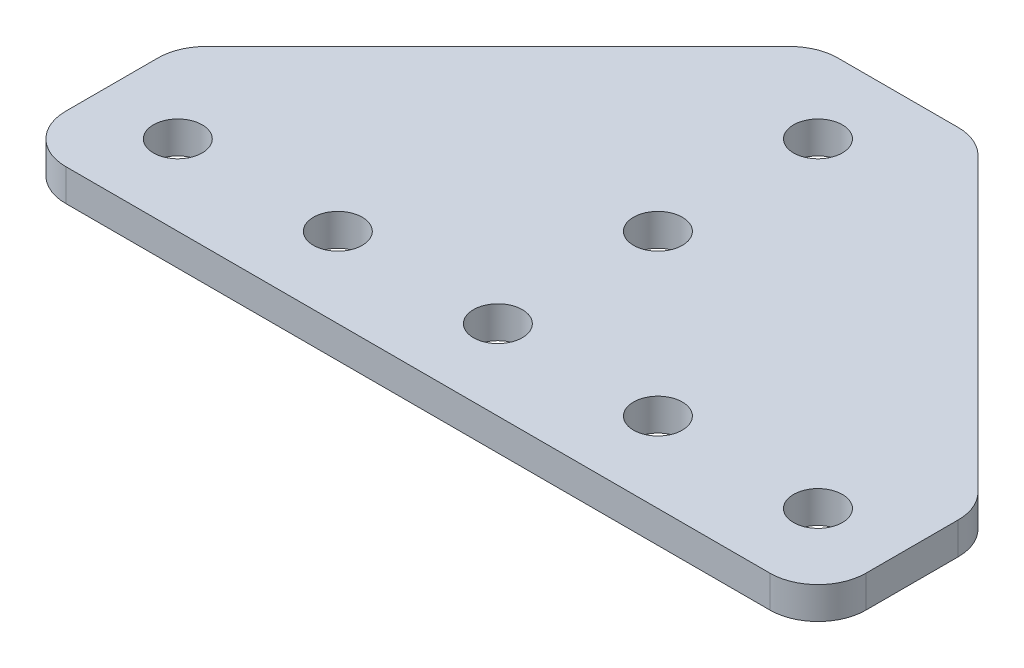
ISO-10303-21;
HEADER;
FILE_DESCRIPTION(('STEP AP214'),'2;1');
FILE_NAME('part.step','',(''),(''),'','','');
FILE_SCHEMA(('AUTOMOTIVE_DESIGN { 1 0 10303 214 1 1 1 1 }'));
ENDSEC;
DATA;
#1=APPLICATION_CONTEXT('core data for automotive mechanical design processes');
#2=APPLICATION_PROTOCOL_DEFINITION('international standard','automotive_design',2000,#1);
#3=PRODUCT_CONTEXT('',#1,'mechanical');
#4=PRODUCT('Part','Part','',(#3));
#5=PRODUCT_RELATED_PRODUCT_CATEGORY('part','',(#4));
#6=PRODUCT_DEFINITION_FORMATION('','',#4);
#7=PRODUCT_DEFINITION_CONTEXT('part definition',#1,'design');
#8=PRODUCT_DEFINITION('design','',#6,#7);
#9=PRODUCT_DEFINITION_SHAPE('','',#8);
#10=(LENGTH_UNIT() NAMED_UNIT(*) SI_UNIT(.MILLI.,.METRE.));
#11=(NAMED_UNIT(*) PLANE_ANGLE_UNIT() SI_UNIT($,.RADIAN.));
#12=(NAMED_UNIT(*) SI_UNIT($,.STERADIAN.) SOLID_ANGLE_UNIT());
#13=UNCERTAINTY_MEASURE_WITH_UNIT(LENGTH_MEASURE(1.E-05),#10,'distance_accuracy_value','');
#14=(GEOMETRIC_REPRESENTATION_CONTEXT(3) GLOBAL_UNCERTAINTY_ASSIGNED_CONTEXT((#13)) GLOBAL_UNIT_ASSIGNED_CONTEXT((#10,
#11,#12)) REPRESENTATION_CONTEXT('',''));
#15=CARTESIAN_POINT('',(0.,0.,0.));
#16=DIRECTION('',(0.,0.,1.));
#17=DIRECTION('',(1.,0.,0.));
#18=AXIS2_PLACEMENT_3D('',#15,#16,#17);
#19=CARTESIAN_POINT('',(0.,2.,0.));
#20=DIRECTION('',(0.,-1.,0.));
#21=DIRECTION('',(0.,0.,-1.));
#22=AXIS2_PLACEMENT_3D('',#19,#20,#21);
#23=PLANE('',#22);
#24=DIRECTION('',(-1.,0.,0.));
#25=VECTOR('',#24,1.);
#26=CARTESIAN_POINT('',(-5.,2.,-30.));
#27=LINE('',#26,#25);
#28=CARTESIAN_POINT('',(3.75735931288072,2.,-30.));
#29=VERTEX_POINT('',#28);
#30=CARTESIAN_POINT('',(-3.75735931288071,2.,-30.));
#31=VERTEX_POINT('',#30);
#32=EDGE_CURVE('E168',#29,#31,#27,.T.);
#33=ORIENTED_EDGE('',*,*,#32,.T.);
#34=CARTESIAN_POINT('',(-3.75735931288071,2.,-27.));
#35=DIRECTION('',(0.,-1.,0.));
#36=DIRECTION('',(0.,0.,-1.));
#37=AXIS2_PLACEMENT_3D('',#34,#35,#36);
#38=CIRCLE('',#37,3.);
#39=CARTESIAN_POINT('',(-5.87867965644035,2.,-29.1213203435596));
#40=VERTEX_POINT('',#39);
#41=EDGE_CURVE('E205',#31,#40,#38,.F.);
#42=ORIENTED_EDGE('',*,*,#41,.T.);
#43=DIRECTION('',(-0.707106781186548,0.,0.707106781186547));
#44=VECTOR('',#43,1.);
#45=CARTESIAN_POINT('',(-25.,2.,-10.));
#46=LINE('',#45,#44);
#47=CARTESIAN_POINT('',(-24.1213203435597,2.,-10.8786796564404));
#48=VERTEX_POINT('',#47);
#49=EDGE_CURVE('E155',#40,#48,#46,.T.);
#50=ORIENTED_EDGE('',*,*,#49,.T.);
#51=CARTESIAN_POINT('',(-22.,2.,-8.75735931288071));
#52=DIRECTION('',(0.,-1.,0.));
#53=DIRECTION('',(0.,0.,-1.));
#54=AXIS2_PLACEMENT_3D('',#51,#52,#53);
#55=CIRCLE('',#54,3.);
#56=CARTESIAN_POINT('',(-25.,2.,-8.75735931288071));
#57=VERTEX_POINT('',#56);
#58=EDGE_CURVE('E191',#48,#57,#55,.F.);
#59=ORIENTED_EDGE('',*,*,#58,.T.);
#60=DIRECTION('',(0.,0.,1.));
#61=VECTOR('',#60,1.);
#62=CARTESIAN_POINT('',(-25.,2.,-10.));
#63=LINE('',#62,#61);
#64=CARTESIAN_POINT('',(-25.,2.,-3.00000000000001));
#65=VERTEX_POINT('',#64);
#66=EDGE_CURVE('E221',#57,#65,#63,.T.);
#67=ORIENTED_EDGE('',*,*,#66,.T.);
#68=CARTESIAN_POINT('',(-22.,2.,-3.00000000000001));
#69=DIRECTION('',(0.,-1.,0.));
#70=DIRECTION('',(0.,0.,-1.));
#71=AXIS2_PLACEMENT_3D('',#68,#69,#70);
#72=CIRCLE('',#71,3.);
#73=CARTESIAN_POINT('',(-22.,2.,0.));
#74=VERTEX_POINT('',#73);
#75=EDGE_CURVE('E197',#65,#74,#72,.F.);
#76=ORIENTED_EDGE('',*,*,#75,.T.);
#77=DIRECTION('',(1.,0.,0.));
#78=VECTOR('',#77,1.);
#79=CARTESIAN_POINT('',(-25.,2.,0.));
#80=LINE('',#79,#78);
#81=CARTESIAN_POINT('',(22.,2.,0.));
#82=VERTEX_POINT('',#81);
#83=EDGE_CURVE('E240',#74,#82,#80,.T.);
#84=ORIENTED_EDGE('',*,*,#83,.T.);
#85=CARTESIAN_POINT('',(22.,2.,-3.));
#86=DIRECTION('',(0.,-1.,0.));
#87=DIRECTION('',(0.,0.,-1.));
#88=AXIS2_PLACEMENT_3D('',#85,#86,#87);
#89=CIRCLE('',#88,3.);
#90=CARTESIAN_POINT('',(25.,2.,-3.));
#91=VERTEX_POINT('',#90);
#92=EDGE_CURVE('E193',#82,#91,#89,.F.);
#93=ORIENTED_EDGE('',*,*,#92,.T.);
#94=DIRECTION('',(0.,0.,-1.));
#95=VECTOR('',#94,1.);
#96=CARTESIAN_POINT('',(25.,2.,-10.));
#97=LINE('',#96,#95);
#98=CARTESIAN_POINT('',(25.,2.,-8.75735931288071));
#99=VERTEX_POINT('',#98);
#100=EDGE_CURVE('E239',#91,#99,#97,.T.);
#101=ORIENTED_EDGE('',*,*,#100,.T.);
#102=CARTESIAN_POINT('',(22.,2.,-8.75735931288071));
#103=DIRECTION('',(0.,-1.,0.));
#104=DIRECTION('',(0.,0.,-1.));
#105=AXIS2_PLACEMENT_3D('',#102,#103,#104);
#106=CIRCLE('',#105,3.);
#107=CARTESIAN_POINT('',(24.1213203435596,2.,-10.8786796564403));
#108=VERTEX_POINT('',#107);
#109=EDGE_CURVE('E62',#99,#108,#106,.F.);
#110=ORIENTED_EDGE('',*,*,#109,.T.);
#111=DIRECTION('',(-0.707106781186548,0.,-0.707106781186548));
#112=VECTOR('',#111,1.);
#113=CARTESIAN_POINT('',(5.,2.,-30.));
#114=LINE('',#113,#112);
#115=CARTESIAN_POINT('',(5.87867965644036,2.,-29.1213203435596));
#116=VERTEX_POINT('',#115);
#117=EDGE_CURVE('E242',#108,#116,#114,.T.);
#118=ORIENTED_EDGE('',*,*,#117,.T.);
#119=CARTESIAN_POINT('',(3.75735931288072,2.,-27.));
#120=DIRECTION('',(0.,-1.,0.));
#121=DIRECTION('',(0.,0.,-1.));
#122=AXIS2_PLACEMENT_3D('',#119,#120,#121);
#123=CIRCLE('',#122,3.);
#124=EDGE_CURVE('E199',#116,#29,#123,.F.);
#125=ORIENTED_EDGE('',*,*,#124,.T.);
#126=EDGE_LOOP('',(#33,#42,#50,#59,#67,#76,#84,#93,#101,#110,#118,#125));
#127=FACE_BOUND('',#126,.T.);
#128=CARTESIAN_POINT('',(0.,2.,-25.));
#129=DIRECTION('',(0.,1.,0.));
#130=DIRECTION('',(0.,0.,1.));
#131=AXIS2_PLACEMENT_3D('',#128,#129,#130);
#132=CIRCLE('',#131,1.525);
#133=CARTESIAN_POINT('',(0.,2.,-23.475));
#134=VERTEX_POINT('',#133);
#135=EDGE_CURVE('E161',#134,#134,#132,.T.);
#136=ORIENTED_EDGE('',*,*,#135,.F.);
#137=EDGE_LOOP('',(#136));
#138=FACE_BOUND('',#137,.T.);
#139=CARTESIAN_POINT('',(0.,2.,-15.));
#140=DIRECTION('',(0.,1.,0.));
#141=DIRECTION('',(0.,0.,1.));
#142=AXIS2_PLACEMENT_3D('',#139,#140,#141);
#143=CIRCLE('',#142,1.525);
#144=CARTESIAN_POINT('',(0.,2.,-13.475));
#145=VERTEX_POINT('',#144);
#146=EDGE_CURVE('E455',#145,#145,#143,.T.);
#147=ORIENTED_EDGE('',*,*,#146,.F.);
#148=EDGE_LOOP('',(#147));
#149=FACE_BOUND('',#148,.T.);
#150=CARTESIAN_POINT('',(0.,2.,-5.));
#151=DIRECTION('',(0.,1.,0.));
#152=DIRECTION('',(0.,0.,1.));
#153=AXIS2_PLACEMENT_3D('',#150,#151,#152);
#154=CIRCLE('',#153,1.525);
#155=CARTESIAN_POINT('',(0.,2.,-3.475));
#156=VERTEX_POINT('',#155);
#157=EDGE_CURVE('E459',#156,#156,#154,.T.);
#158=ORIENTED_EDGE('',*,*,#157,.F.);
#159=EDGE_LOOP('',(#158));
#160=FACE_BOUND('',#159,.T.);
#161=CARTESIAN_POINT('',(10.,2.,-5.));
#162=DIRECTION('',(0.,1.,0.));
#163=DIRECTION('',(0.,0.,1.));
#164=AXIS2_PLACEMENT_3D('',#161,#162,#163);
#165=CIRCLE('',#164,1.525);
#166=CARTESIAN_POINT('',(10.,2.,-3.475));
#167=VERTEX_POINT('',#166);
#168=EDGE_CURVE('E461',#167,#167,#165,.T.);
#169=ORIENTED_EDGE('',*,*,#168,.F.);
#170=EDGE_LOOP('',(#169));
#171=FACE_BOUND('',#170,.T.);
#172=CARTESIAN_POINT('',(-10.,2.,-5.));
#173=DIRECTION('',(0.,1.,0.));
#174=DIRECTION('',(0.,0.,1.));
#175=AXIS2_PLACEMENT_3D('',#172,#173,#174);
#176=CIRCLE('',#175,1.525);
#177=CARTESIAN_POINT('',(-10.,2.,-3.475));
#178=VERTEX_POINT('',#177);
#179=EDGE_CURVE('E466',#178,#178,#176,.T.);
#180=ORIENTED_EDGE('',*,*,#179,.F.);
#181=EDGE_LOOP('',(#180));
#182=FACE_BOUND('',#181,.T.);
#183=CARTESIAN_POINT('',(20.,2.,-5.));
#184=DIRECTION('',(0.,1.,0.));
#185=DIRECTION('',(0.,0.,1.));
#186=AXIS2_PLACEMENT_3D('',#183,#184,#185);
#187=CIRCLE('',#186,1.525);
#188=CARTESIAN_POINT('',(20.,2.,-3.475));
#189=VERTEX_POINT('',#188);
#190=EDGE_CURVE('E478',#189,#189,#187,.T.);
#191=ORIENTED_EDGE('',*,*,#190,.F.);
#192=EDGE_LOOP('',(#191));
#193=FACE_BOUND('',#192,.T.);
#194=CARTESIAN_POINT('',(-20.,2.,-5.));
#195=DIRECTION('',(0.,1.,0.));
#196=DIRECTION('',(0.,0.,1.));
#197=AXIS2_PLACEMENT_3D('',#194,#195,#196);
#198=CIRCLE('',#197,1.525);
#199=CARTESIAN_POINT('',(-20.,2.,-3.475));
#200=VERTEX_POINT('',#199);
#201=EDGE_CURVE('E485',#200,#200,#198,.T.);
#202=ORIENTED_EDGE('',*,*,#201,.F.);
#203=EDGE_LOOP('',(#202));
#204=FACE_BOUND('',#203,.T.);
#205=ADVANCED_FACE('F45',(#127,#138,#149,#160,#171,#182,#193,#204),#23,.F.);
#206=CARTESIAN_POINT('',(0.,0.,0.));
#207=DIRECTION('',(0.,-1.,0.));
#208=DIRECTION('',(0.,0.,-1.));
#209=AXIS2_PLACEMENT_3D('',#206,#207,#208);
#210=PLANE('',#209);
#211=CARTESIAN_POINT('',(20.,0.,-5.));
#212=DIRECTION('',(0.,1.,0.));
#213=DIRECTION('',(0.,0.,1.));
#214=AXIS2_PLACEMENT_3D('',#211,#212,#213);
#215=CIRCLE('',#214,1.525);
#216=CARTESIAN_POINT('',(20.,0.,-3.475));
#217=VERTEX_POINT('',#216);
#218=EDGE_CURVE('E479',#217,#217,#215,.T.);
#219=ORIENTED_EDGE('',*,*,#218,.T.);
#220=EDGE_LOOP('',(#219));
#221=FACE_BOUND('',#220,.T.);
#222=CARTESIAN_POINT('',(10.,0.,-5.));
#223=DIRECTION('',(0.,1.,0.));
#224=DIRECTION('',(0.,0.,1.));
#225=AXIS2_PLACEMENT_3D('',#222,#223,#224);
#226=CIRCLE('',#225,1.525);
#227=CARTESIAN_POINT('',(10.,0.,-3.475));
#228=VERTEX_POINT('',#227);
#229=EDGE_CURVE('E470',#228,#228,#226,.T.);
#230=ORIENTED_EDGE('',*,*,#229,.T.);
#231=EDGE_LOOP('',(#230));
#232=FACE_BOUND('',#231,.T.);
#233=CARTESIAN_POINT('',(0.,0.,-15.));
#234=DIRECTION('',(0.,1.,0.));
#235=DIRECTION('',(0.,0.,1.));
#236=AXIS2_PLACEMENT_3D('',#233,#234,#235);
#237=CIRCLE('',#236,1.525);
#238=CARTESIAN_POINT('',(0.,0.,-13.475));
#239=VERTEX_POINT('',#238);
#240=EDGE_CURVE('E454',#239,#239,#237,.T.);
#241=ORIENTED_EDGE('',*,*,#240,.T.);
#242=EDGE_LOOP('',(#241));
#243=FACE_BOUND('',#242,.T.);
#244=DIRECTION('',(-0.707106781186548,0.,0.707106781186547));
#245=VECTOR('',#244,1.);
#246=CARTESIAN_POINT('',(-25.,0.,-10.));
#247=LINE('',#246,#245);
#248=CARTESIAN_POINT('',(-5.87867965644035,0.,-29.1213203435596));
#249=VERTEX_POINT('',#248);
#250=CARTESIAN_POINT('',(-24.1213203435597,0.,-10.8786796564404));
#251=VERTEX_POINT('',#250);
#252=EDGE_CURVE('E149',#249,#251,#247,.T.);
#253=ORIENTED_EDGE('',*,*,#252,.F.);
#254=CARTESIAN_POINT('',(-3.75735931288071,0.,-27.));
#255=DIRECTION('',(0.,-1.,0.));
#256=DIRECTION('',(0.,0.,-1.));
#257=AXIS2_PLACEMENT_3D('',#254,#255,#256);
#258=CIRCLE('',#257,3.);
#259=CARTESIAN_POINT('',(-3.75735931288071,0.,-30.));
#260=VERTEX_POINT('',#259);
#261=EDGE_CURVE('E134',#249,#260,#258,.T.);
#262=ORIENTED_EDGE('',*,*,#261,.T.);
#263=DIRECTION('',(-1.,0.,0.));
#264=VECTOR('',#263,1.);
#265=CARTESIAN_POINT('',(-5.,0.,-30.));
#266=LINE('',#265,#264);
#267=CARTESIAN_POINT('',(3.75735931288072,0.,-30.));
#268=VERTEX_POINT('',#267);
#269=EDGE_CURVE('E179',#268,#260,#266,.T.);
#270=ORIENTED_EDGE('',*,*,#269,.F.);
#271=CARTESIAN_POINT('',(3.75735931288072,0.,-27.));
#272=DIRECTION('',(0.,-1.,0.));
#273=DIRECTION('',(0.,0.,-1.));
#274=AXIS2_PLACEMENT_3D('',#271,#272,#273);
#275=CIRCLE('',#274,3.);
#276=CARTESIAN_POINT('',(5.87867965644036,0.,-29.1213203435596));
#277=VERTEX_POINT('',#276);
#278=EDGE_CURVE('E141',#268,#277,#275,.T.);
#279=ORIENTED_EDGE('',*,*,#278,.T.);
#280=DIRECTION('',(-0.707106781186548,0.,-0.707106781186548));
#281=VECTOR('',#280,1.);
#282=CARTESIAN_POINT('',(5.,0.,-30.));
#283=LINE('',#282,#281);
#284=CARTESIAN_POINT('',(24.1213203435596,0.,-10.8786796564403));
#285=VERTEX_POINT('',#284);
#286=EDGE_CURVE('E178',#285,#277,#283,.T.);
#287=ORIENTED_EDGE('',*,*,#286,.F.);
#288=CARTESIAN_POINT('',(22.,0.,-8.75735931288071));
#289=DIRECTION('',(0.,-1.,0.));
#290=DIRECTION('',(0.,0.,-1.));
#291=AXIS2_PLACEMENT_3D('',#288,#289,#290);
#292=CIRCLE('',#291,3.);
#293=CARTESIAN_POINT('',(25.,0.,-8.75735931288071));
#294=VERTEX_POINT('',#293);
#295=EDGE_CURVE('E189',#285,#294,#292,.T.);
#296=ORIENTED_EDGE('',*,*,#295,.T.);
#297=DIRECTION('',(0.,0.,-1.));
#298=VECTOR('',#297,1.);
#299=CARTESIAN_POINT('',(25.,0.,-10.));
#300=LINE('',#299,#298);
#301=CARTESIAN_POINT('',(25.,0.,-3.));
#302=VERTEX_POINT('',#301);
#303=EDGE_CURVE('E174',#302,#294,#300,.T.);
#304=ORIENTED_EDGE('',*,*,#303,.F.);
#305=CARTESIAN_POINT('',(22.,0.,-3.));
#306=DIRECTION('',(0.,-1.,0.));
#307=DIRECTION('',(0.,0.,-1.));
#308=AXIS2_PLACEMENT_3D('',#305,#306,#307);
#309=CIRCLE('',#308,3.);
#310=CARTESIAN_POINT('',(22.,0.,0.));
#311=VERTEX_POINT('',#310);
#312=EDGE_CURVE('E153',#302,#311,#309,.T.);
#313=ORIENTED_EDGE('',*,*,#312,.T.);
#314=DIRECTION('',(1.,0.,0.));
#315=VECTOR('',#314,1.);
#316=CARTESIAN_POINT('',(-25.,0.,0.));
#317=LINE('',#316,#315);
#318=CARTESIAN_POINT('',(-22.,0.,0.));
#319=VERTEX_POINT('',#318);
#320=EDGE_CURVE('E163',#319,#311,#317,.T.);
#321=ORIENTED_EDGE('',*,*,#320,.F.);
#322=CARTESIAN_POINT('',(-22.,0.,-3.00000000000001));
#323=DIRECTION('',(0.,-1.,0.));
#324=DIRECTION('',(0.,0.,-1.));
#325=AXIS2_PLACEMENT_3D('',#322,#323,#324);
#326=CIRCLE('',#325,3.);
#327=CARTESIAN_POINT('',(-25.,0.,-3.00000000000001));
#328=VERTEX_POINT('',#327);
#329=EDGE_CURVE('E183',#319,#328,#326,.T.);
#330=ORIENTED_EDGE('',*,*,#329,.T.);
#331=DIRECTION('',(0.,0.,1.));
#332=VECTOR('',#331,1.);
#333=CARTESIAN_POINT('',(-25.,0.,-10.));
#334=LINE('',#333,#332);
#335=CARTESIAN_POINT('',(-25.,0.,-8.75735931288071));
#336=VERTEX_POINT('',#335);
#337=EDGE_CURVE('E159',#336,#328,#334,.T.);
#338=ORIENTED_EDGE('',*,*,#337,.F.);
#339=CARTESIAN_POINT('',(-22.,0.,-8.75735931288071));
#340=DIRECTION('',(0.,-1.,0.));
#341=DIRECTION('',(0.,0.,-1.));
#342=AXIS2_PLACEMENT_3D('',#339,#340,#341);
#343=CIRCLE('',#342,3.);
#344=EDGE_CURVE('E157',#336,#251,#343,.T.);
#345=ORIENTED_EDGE('',*,*,#344,.T.);
#346=EDGE_LOOP('',(#253,#262,#270,#279,#287,#296,#304,#313,#321,#330,#338,#345));
#347=FACE_BOUND('',#346,.T.);
#348=CARTESIAN_POINT('',(0.,0.,-25.));
#349=DIRECTION('',(0.,1.,0.));
#350=DIRECTION('',(0.,0.,1.));
#351=AXIS2_PLACEMENT_3D('',#348,#349,#350);
#352=CIRCLE('',#351,1.525);
#353=CARTESIAN_POINT('',(0.,0.,-23.475));
#354=VERTEX_POINT('',#353);
#355=EDGE_CURVE('E170',#354,#354,#352,.T.);
#356=ORIENTED_EDGE('',*,*,#355,.T.);
#357=EDGE_LOOP('',(#356));
#358=FACE_BOUND('',#357,.T.);
#359=CARTESIAN_POINT('',(0.,0.,-5.));
#360=DIRECTION('',(0.,1.,0.));
#361=DIRECTION('',(0.,0.,1.));
#362=AXIS2_PLACEMENT_3D('',#359,#360,#361);
#363=CIRCLE('',#362,1.525);
#364=CARTESIAN_POINT('',(0.,0.,-3.475));
#365=VERTEX_POINT('',#364);
#366=EDGE_CURVE('E462',#365,#365,#363,.T.);
#367=ORIENTED_EDGE('',*,*,#366,.T.);
#368=EDGE_LOOP('',(#367));
#369=FACE_BOUND('',#368,.T.);
#370=CARTESIAN_POINT('',(-10.,0.,-5.));
#371=DIRECTION('',(0.,1.,0.));
#372=DIRECTION('',(0.,0.,1.));
#373=AXIS2_PLACEMENT_3D('',#370,#371,#372);
#374=CIRCLE('',#373,1.525);
#375=CARTESIAN_POINT('',(-10.,0.,-3.475));
#376=VERTEX_POINT('',#375);
#377=EDGE_CURVE('E471',#376,#376,#374,.T.);
#378=ORIENTED_EDGE('',*,*,#377,.T.);
#379=EDGE_LOOP('',(#378));
#380=FACE_BOUND('',#379,.T.);
#381=CARTESIAN_POINT('',(-20.,0.,-5.));
#382=DIRECTION('',(0.,1.,0.));
#383=DIRECTION('',(0.,0.,1.));
#384=AXIS2_PLACEMENT_3D('',#381,#382,#383);
#385=CIRCLE('',#384,1.525);
#386=CARTESIAN_POINT('',(-20.,0.,-3.475));
#387=VERTEX_POINT('',#386);
#388=EDGE_CURVE('E484',#387,#387,#385,.T.);
#389=ORIENTED_EDGE('',*,*,#388,.T.);
#390=EDGE_LOOP('',(#389));
#391=FACE_BOUND('',#390,.T.);
#392=ADVANCED_FACE('F156',(#221,#232,#243,#347,#358,#369,#380,#391),#210,.T.);
#393=CARTESIAN_POINT('',(-25.,2.,-10.));
#394=DIRECTION('',(0.707106781186547,0.,0.707106781186548));
#395=DIRECTION('',(0.707106781186548,0.,-0.707106781186547));
#396=AXIS2_PLACEMENT_3D('',#393,#394,#395);
#397=PLANE('',#396);
#398=ORIENTED_EDGE('',*,*,#49,.F.);
#399=DIRECTION('',(0.,-1.,0.));
#400=VECTOR('',#399,1.);
#401=CARTESIAN_POINT('',(-5.87867965644035,2.,-29.1213203435596));
#402=LINE('',#401,#400);
#403=EDGE_CURVE('E137',#40,#249,#402,.T.);
#404=ORIENTED_EDGE('',*,*,#403,.T.);
#405=ORIENTED_EDGE('',*,*,#252,.T.);
#406=DIRECTION('',(0.,-1.,0.));
#407=VECTOR('',#406,1.);
#408=CARTESIAN_POINT('',(-24.1213203435597,2.,-10.8786796564404));
#409=LINE('',#408,#407);
#410=EDGE_CURVE('E152',#251,#48,#409,.F.);
#411=ORIENTED_EDGE('',*,*,#410,.T.);
#412=EDGE_LOOP('',(#398,#404,#405,#411));
#413=FACE_BOUND('',#412,.T.);
#414=ADVANCED_FACE('F146',(#413),#397,.F.);
#415=CARTESIAN_POINT('',(-25.,2.,-10.));
#416=DIRECTION('',(1.,0.,0.));
#417=DIRECTION('',(0.,0.,-1.));
#418=AXIS2_PLACEMENT_3D('',#415,#416,#417);
#419=PLANE('',#418);
#420=ORIENTED_EDGE('',*,*,#337,.T.);
#421=DIRECTION('',(0.,-1.,0.));
#422=VECTOR('',#421,1.);
#423=CARTESIAN_POINT('',(-25.,2.,-3.00000000000001));
#424=LINE('',#423,#422);
#425=EDGE_CURVE('E11',#328,#65,#424,.F.);
#426=ORIENTED_EDGE('',*,*,#425,.T.);
#427=ORIENTED_EDGE('',*,*,#66,.F.);
#428=DIRECTION('',(0.,-1.,0.));
#429=VECTOR('',#428,1.);
#430=CARTESIAN_POINT('',(-25.,2.,-8.75735931288071));
#431=LINE('',#430,#429);
#432=EDGE_CURVE('E49',#57,#336,#431,.T.);
#433=ORIENTED_EDGE('',*,*,#432,.T.);
#434=EDGE_LOOP('',(#420,#426,#427,#433));
#435=FACE_BOUND('',#434,.T.);
#436=ADVANCED_FACE('F222',(#435),#419,.F.);
#437=CARTESIAN_POINT('',(-25.,2.,0.));
#438=DIRECTION('',(0.,0.,-1.));
#439=DIRECTION('',(-1.,0.,0.));
#440=AXIS2_PLACEMENT_3D('',#437,#438,#439);
#441=PLANE('',#440);
#442=ORIENTED_EDGE('',*,*,#83,.F.);
#443=DIRECTION('',(0.,-1.,0.));
#444=VECTOR('',#443,1.);
#445=CARTESIAN_POINT('',(-22.,2.,0.));
#446=LINE('',#445,#444);
#447=EDGE_CURVE('E214',#74,#319,#446,.T.);
#448=ORIENTED_EDGE('',*,*,#447,.T.);
#449=ORIENTED_EDGE('',*,*,#320,.T.);
#450=DIRECTION('',(0.,-1.,0.));
#451=VECTOR('',#450,1.);
#452=CARTESIAN_POINT('',(22.,2.,0.));
#453=LINE('',#452,#451);
#454=EDGE_CURVE('E213',#311,#82,#453,.F.);
#455=ORIENTED_EDGE('',*,*,#454,.T.);
#456=EDGE_LOOP('',(#442,#448,#449,#455));
#457=FACE_BOUND('',#456,.T.);
#458=ADVANCED_FACE('F232',(#457),#441,.F.);
#459=CARTESIAN_POINT('',(25.,2.,-10.));
#460=DIRECTION('',(-1.,0.,0.));
#461=DIRECTION('',(0.,0.,1.));
#462=AXIS2_PLACEMENT_3D('',#459,#460,#461);
#463=PLANE('',#462);
#464=ORIENTED_EDGE('',*,*,#303,.T.);
#465=DIRECTION('',(0.,-1.,0.));
#466=VECTOR('',#465,1.);
#467=CARTESIAN_POINT('',(25.,2.,-8.75735931288071));
#468=LINE('',#467,#466);
#469=EDGE_CURVE('E211',#294,#99,#468,.F.);
#470=ORIENTED_EDGE('',*,*,#469,.T.);
#471=ORIENTED_EDGE('',*,*,#100,.F.);
#472=DIRECTION('',(0.,-1.,0.));
#473=VECTOR('',#472,1.);
#474=CARTESIAN_POINT('',(25.,2.,-3.));
#475=LINE('',#474,#473);
#476=EDGE_CURVE('E208',#91,#302,#475,.T.);
#477=ORIENTED_EDGE('',*,*,#476,.T.);
#478=EDGE_LOOP('',(#464,#470,#471,#477));
#479=FACE_BOUND('',#478,.T.);
#480=ADVANCED_FACE('F265',(#479),#463,.F.);
#481=CARTESIAN_POINT('',(5.,2.,-30.));
#482=DIRECTION('',(-0.707106781186547,0.,0.707106781186547));
#483=DIRECTION('',(0.707106781186548,0.,0.707106781186548));
#484=AXIS2_PLACEMENT_3D('',#481,#482,#483);
#485=PLANE('',#484);
#486=ORIENTED_EDGE('',*,*,#286,.T.);
#487=DIRECTION('',(0.,-1.,0.));
#488=VECTOR('',#487,1.);
#489=CARTESIAN_POINT('',(5.87867965644036,2.,-29.1213203435596));
#490=LINE('',#489,#488);
#491=EDGE_CURVE('E60',#277,#116,#490,.F.);
#492=ORIENTED_EDGE('',*,*,#491,.T.);
#493=ORIENTED_EDGE('',*,*,#117,.F.);
#494=DIRECTION('',(0.,-1.,0.));
#495=VECTOR('',#494,1.);
#496=CARTESIAN_POINT('',(24.1213203435596,2.,-10.8786796564404));
#497=LINE('',#496,#495);
#498=EDGE_CURVE('E204',#108,#285,#497,.T.);
#499=ORIENTED_EDGE('',*,*,#498,.T.);
#500=EDGE_LOOP('',(#486,#492,#493,#499));
#501=FACE_BOUND('',#500,.T.);
#502=ADVANCED_FACE('F254',(#501),#485,.F.);
#503=CARTESIAN_POINT('',(-5.,2.,-30.));
#504=DIRECTION('',(0.,0.,1.));
#505=DIRECTION('',(1.,0.,0.));
#506=AXIS2_PLACEMENT_3D('',#503,#504,#505);
#507=PLANE('',#506);
#508=ORIENTED_EDGE('',*,*,#269,.T.);
#509=DIRECTION('',(0.,-1.,0.));
#510=VECTOR('',#509,1.);
#511=CARTESIAN_POINT('',(-3.75735931288071,2.,-30.));
#512=LINE('',#511,#510);
#513=EDGE_CURVE('E140',#260,#31,#512,.F.);
#514=ORIENTED_EDGE('',*,*,#513,.T.);
#515=ORIENTED_EDGE('',*,*,#32,.F.);
#516=DIRECTION('',(0.,-1.,0.));
#517=VECTOR('',#516,1.);
#518=CARTESIAN_POINT('',(3.75735931288072,2.,-30.));
#519=LINE('',#518,#517);
#520=EDGE_CURVE('E142',#29,#268,#519,.T.);
#521=ORIENTED_EDGE('',*,*,#520,.T.);
#522=EDGE_LOOP('',(#508,#514,#515,#521));
#523=FACE_BOUND('',#522,.T.);
#524=ADVANCED_FACE('F253',(#523),#507,.F.);
#525=CARTESIAN_POINT('',(0.,2.,-25.));
#526=DIRECTION('',(0.,-1.,0.));
#527=DIRECTION('',(0.,0.,-1.));
#528=AXIS2_PLACEMENT_3D('',#525,#526,#527);
#529=CYLINDRICAL_SURFACE('',#528,1.525);
#530=ORIENTED_EDGE('',*,*,#135,.T.);
#531=EDGE_LOOP('',(#530));
#532=FACE_BOUND('',#531,.T.);
#533=ORIENTED_EDGE('',*,*,#355,.F.);
#534=EDGE_LOOP('',(#533));
#535=FACE_BOUND('',#534,.T.);
#536=ADVANCED_FACE('F278',(#532,#535),#529,.F.);
#537=CARTESIAN_POINT('',(0.,2.,-15.));
#538=DIRECTION('',(0.,-1.,0.));
#539=DIRECTION('',(0.,0.,-1.));
#540=AXIS2_PLACEMENT_3D('',#537,#538,#539);
#541=CYLINDRICAL_SURFACE('',#540,1.525);
#542=ORIENTED_EDGE('',*,*,#146,.T.);
#543=EDGE_LOOP('',(#542));
#544=FACE_BOUND('',#543,.T.);
#545=ORIENTED_EDGE('',*,*,#240,.F.);
#546=EDGE_LOOP('',(#545));
#547=FACE_BOUND('',#546,.T.);
#548=ADVANCED_FACE('F374',(#544,#547),#541,.F.);
#549=CARTESIAN_POINT('',(0.,2.,-5.));
#550=DIRECTION('',(0.,-1.,0.));
#551=DIRECTION('',(0.,0.,-1.));
#552=AXIS2_PLACEMENT_3D('',#549,#550,#551);
#553=CYLINDRICAL_SURFACE('',#552,1.525);
#554=ORIENTED_EDGE('',*,*,#157,.T.);
#555=EDGE_LOOP('',(#554));
#556=FACE_BOUND('',#555,.T.);
#557=ORIENTED_EDGE('',*,*,#366,.F.);
#558=EDGE_LOOP('',(#557));
#559=FACE_BOUND('',#558,.T.);
#560=ADVANCED_FACE('F368',(#556,#559),#553,.F.);
#561=CARTESIAN_POINT('',(10.,2.,-5.));
#562=DIRECTION('',(0.,-1.,0.));
#563=DIRECTION('',(0.,0.,-1.));
#564=AXIS2_PLACEMENT_3D('',#561,#562,#563);
#565=CYLINDRICAL_SURFACE('',#564,1.525);
#566=ORIENTED_EDGE('',*,*,#168,.T.);
#567=EDGE_LOOP('',(#566));
#568=FACE_BOUND('',#567,.T.);
#569=ORIENTED_EDGE('',*,*,#229,.F.);
#570=EDGE_LOOP('',(#569));
#571=FACE_BOUND('',#570,.T.);
#572=ADVANCED_FACE('F360',(#568,#571),#565,.F.);
#573=CARTESIAN_POINT('',(-10.,2.,-5.));
#574=DIRECTION('',(0.,-1.,0.));
#575=DIRECTION('',(0.,0.,-1.));
#576=AXIS2_PLACEMENT_3D('',#573,#574,#575);
#577=CYLINDRICAL_SURFACE('',#576,1.525);
#578=ORIENTED_EDGE('',*,*,#179,.T.);
#579=EDGE_LOOP('',(#578));
#580=FACE_BOUND('',#579,.T.);
#581=ORIENTED_EDGE('',*,*,#377,.F.);
#582=EDGE_LOOP('',(#581));
#583=FACE_BOUND('',#582,.T.);
#584=ADVANCED_FACE('F346',(#580,#583),#577,.F.);
#585=CARTESIAN_POINT('',(20.,2.,-5.));
#586=DIRECTION('',(0.,-1.,0.));
#587=DIRECTION('',(0.,0.,-1.));
#588=AXIS2_PLACEMENT_3D('',#585,#586,#587);
#589=CYLINDRICAL_SURFACE('',#588,1.525);
#590=ORIENTED_EDGE('',*,*,#190,.T.);
#591=EDGE_LOOP('',(#590));
#592=FACE_BOUND('',#591,.T.);
#593=ORIENTED_EDGE('',*,*,#218,.F.);
#594=EDGE_LOOP('',(#593));
#595=FACE_BOUND('',#594,.T.);
#596=ADVANCED_FACE('F337',(#592,#595),#589,.F.);
#597=CARTESIAN_POINT('',(-20.,2.,-5.));
#598=DIRECTION('',(0.,-1.,0.));
#599=DIRECTION('',(0.,0.,-1.));
#600=AXIS2_PLACEMENT_3D('',#597,#598,#599);
#601=CYLINDRICAL_SURFACE('',#600,1.525);
#602=ORIENTED_EDGE('',*,*,#201,.T.);
#603=EDGE_LOOP('',(#602));
#604=FACE_BOUND('',#603,.T.);
#605=ORIENTED_EDGE('',*,*,#388,.F.);
#606=EDGE_LOOP('',(#605));
#607=FACE_BOUND('',#606,.T.);
#608=ADVANCED_FACE('F299',(#604,#607),#601,.F.);
#609=CARTESIAN_POINT('',(-3.75735931288071,2.,-27.));
#610=DIRECTION('',(0.,-1.,0.));
#611=DIRECTION('',(0.,0.,-1.));
#612=AXIS2_PLACEMENT_3D('',#609,#610,#611);
#613=CYLINDRICAL_SURFACE('',#612,3.);
#614=ORIENTED_EDGE('',*,*,#41,.F.);
#615=ORIENTED_EDGE('',*,*,#513,.F.);
#616=ORIENTED_EDGE('',*,*,#261,.F.);
#617=ORIENTED_EDGE('',*,*,#403,.F.);
#618=EDGE_LOOP('',(#614,#615,#616,#617));
#619=FACE_BOUND('',#618,.T.);
#620=ADVANCED_FACE('F133',(#619),#613,.T.);
#621=CARTESIAN_POINT('',(3.75735931288072,2.,-27.));
#622=DIRECTION('',(0.,-1.,0.));
#623=DIRECTION('',(0.,0.,-1.));
#624=AXIS2_PLACEMENT_3D('',#621,#622,#623);
#625=CYLINDRICAL_SURFACE('',#624,3.);
#626=ORIENTED_EDGE('',*,*,#124,.F.);
#627=ORIENTED_EDGE('',*,*,#491,.F.);
#628=ORIENTED_EDGE('',*,*,#278,.F.);
#629=ORIENTED_EDGE('',*,*,#520,.F.);
#630=EDGE_LOOP('',(#626,#627,#628,#629));
#631=FACE_BOUND('',#630,.T.);
#632=ADVANCED_FACE('F251',(#631),#625,.T.);
#633=CARTESIAN_POINT('',(22.,2.,-8.75735931288071));
#634=DIRECTION('',(0.,-1.,0.));
#635=DIRECTION('',(0.,0.,-1.));
#636=AXIS2_PLACEMENT_3D('',#633,#634,#635);
#637=CYLINDRICAL_SURFACE('',#636,3.);
#638=ORIENTED_EDGE('',*,*,#109,.F.);
#639=ORIENTED_EDGE('',*,*,#469,.F.);
#640=ORIENTED_EDGE('',*,*,#295,.F.);
#641=ORIENTED_EDGE('',*,*,#498,.F.);
#642=EDGE_LOOP('',(#638,#639,#640,#641));
#643=FACE_BOUND('',#642,.T.);
#644=ADVANCED_FACE('F256',(#643),#637,.T.);
#645=CARTESIAN_POINT('',(-22.,2.,-3.00000000000001));
#646=DIRECTION('',(0.,-1.,0.));
#647=DIRECTION('',(0.,0.,-1.));
#648=AXIS2_PLACEMENT_3D('',#645,#646,#647);
#649=CYLINDRICAL_SURFACE('',#648,3.);
#650=ORIENTED_EDGE('',*,*,#75,.F.);
#651=ORIENTED_EDGE('',*,*,#425,.F.);
#652=ORIENTED_EDGE('',*,*,#329,.F.);
#653=ORIENTED_EDGE('',*,*,#447,.F.);
#654=EDGE_LOOP('',(#650,#651,#652,#653));
#655=FACE_BOUND('',#654,.T.);
#656=ADVANCED_FACE('F231',(#655),#649,.T.);
#657=CARTESIAN_POINT('',(-22.,2.,-8.75735931288071));
#658=DIRECTION('',(0.,-1.,0.));
#659=DIRECTION('',(0.,0.,-1.));
#660=AXIS2_PLACEMENT_3D('',#657,#658,#659);
#661=CYLINDRICAL_SURFACE('',#660,3.);
#662=ORIENTED_EDGE('',*,*,#58,.F.);
#663=ORIENTED_EDGE('',*,*,#410,.F.);
#664=ORIENTED_EDGE('',*,*,#344,.F.);
#665=ORIENTED_EDGE('',*,*,#432,.F.);
#666=EDGE_LOOP('',(#662,#663,#664,#665));
#667=FACE_BOUND('',#666,.T.);
#668=ADVANCED_FACE('F270',(#667),#661,.T.);
#669=CARTESIAN_POINT('',(22.,2.,-3.));
#670=DIRECTION('',(0.,-1.,0.));
#671=DIRECTION('',(0.,0.,-1.));
#672=AXIS2_PLACEMENT_3D('',#669,#670,#671);
#673=CYLINDRICAL_SURFACE('',#672,3.);
#674=ORIENTED_EDGE('',*,*,#92,.F.);
#675=ORIENTED_EDGE('',*,*,#454,.F.);
#676=ORIENTED_EDGE('',*,*,#312,.F.);
#677=ORIENTED_EDGE('',*,*,#476,.F.);
#678=EDGE_LOOP('',(#674,#675,#676,#677));
#679=FACE_BOUND('',#678,.T.);
#680=ADVANCED_FACE('F42',(#679),#673,.T.);
#681=CLOSED_SHELL('',(#205,#392,#414,#436,#458,#480,#502,#524,#536,#548,#560,#572,#584,#596,
#608,#620,#632,#644,#656,#668,#680));
#682=MANIFOLD_SOLID_BREP('B2',#681);
#683=ADVANCED_BREP_SHAPE_REPRESENTATION('',(#18,#682),#14);
#684=SHAPE_DEFINITION_REPRESENTATION(#9,#683);
ENDSEC;
END-ISO-10303-21;
